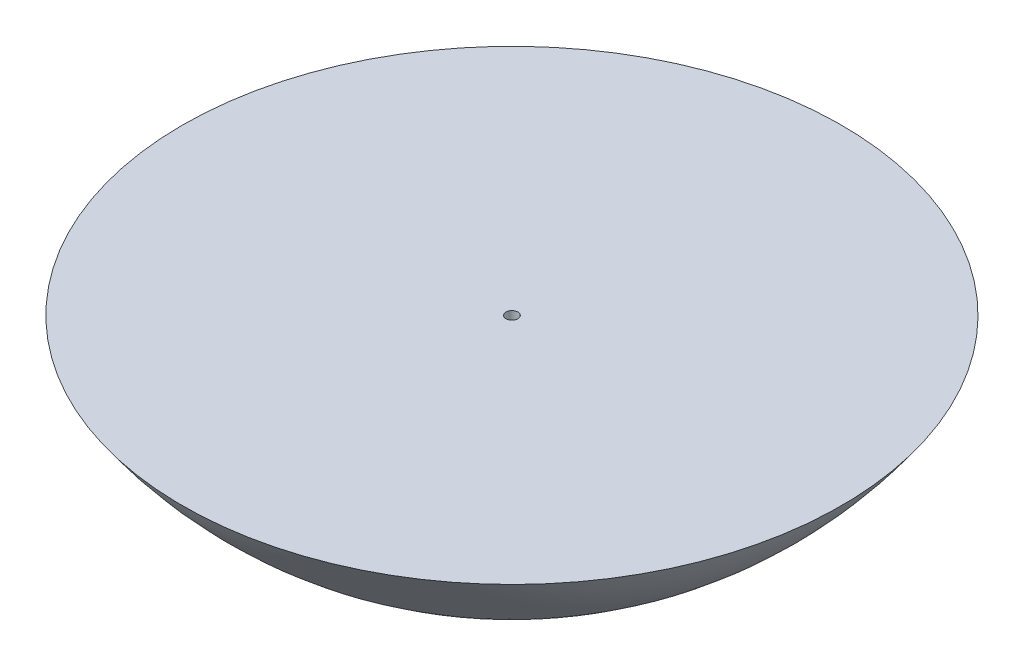
ISO-10303-21;
HEADER;
FILE_DESCRIPTION(('STEP AP214'),'2;1');
FILE_NAME('part.step','',(''),(''),'','','');
FILE_SCHEMA(('AUTOMOTIVE_DESIGN { 1 0 10303 214 1 1 1 1 }'));
ENDSEC;
DATA;
#1=APPLICATION_CONTEXT('core data for automotive mechanical design processes');
#2=APPLICATION_PROTOCOL_DEFINITION('international standard','automotive_design',2000,#1);
#3=PRODUCT_CONTEXT('',#1,'mechanical');
#4=PRODUCT('Part','Part','',(#3));
#5=PRODUCT_RELATED_PRODUCT_CATEGORY('part','',(#4));
#6=PRODUCT_DEFINITION_FORMATION('','',#4);
#7=PRODUCT_DEFINITION_CONTEXT('part definition',#1,'design');
#8=PRODUCT_DEFINITION('design','',#6,#7);
#9=PRODUCT_DEFINITION_SHAPE('','',#8);
#10=(LENGTH_UNIT() NAMED_UNIT(*) SI_UNIT(.MILLI.,.METRE.));
#11=(NAMED_UNIT(*) PLANE_ANGLE_UNIT() SI_UNIT($,.RADIAN.));
#12=(NAMED_UNIT(*) SI_UNIT($,.STERADIAN.) SOLID_ANGLE_UNIT());
#13=UNCERTAINTY_MEASURE_WITH_UNIT(LENGTH_MEASURE(1.E-05),#10,'distance_accuracy_value','');
#14=(GEOMETRIC_REPRESENTATION_CONTEXT(3) GLOBAL_UNCERTAINTY_ASSIGNED_CONTEXT((#13)) GLOBAL_UNIT_ASSIGNED_CONTEXT((#10,
#11,#12)) REPRESENTATION_CONTEXT('',''));
#15=CARTESIAN_POINT('',(0.,0.,0.));
#16=DIRECTION('',(0.,0.,1.));
#17=DIRECTION('',(1.,0.,0.));
#18=AXIS2_PLACEMENT_3D('',#15,#16,#17);
#19=CARTESIAN_POINT('',(0.,0.,0.));
#20=DIRECTION('',(0.,-1.,0.));
#21=DIRECTION('',(-1.,0.,0.));
#22=AXIS2_PLACEMENT_3D('',#19,#20,#21);
#23=SPHERICAL_SURFACE('',#22,33.8);
#24=CARTESIAN_POINT('',(0.,-33.7963015728053,0.));
#25=DIRECTION('',(0.,1.,0.));
#26=DIRECTION('',(0.,0.,1.));
#27=AXIS2_PLACEMENT_3D('',#24,#25,#26);
#28=CIRCLE('',#27,0.5);
#29=CARTESIAN_POINT('',(-0.49999999999911,-33.7963015728053,0.));
#30=VERTEX_POINT('',#29);
#31=EDGE_CURVE('E41',#30,#30,#28,.F.);
#32=CARTESIAN_POINT('',(0.,-19.1,0.));
#33=DIRECTION('',(0.,1.,0.));
#34=DIRECTION('',(0.,0.,1.));
#35=AXIS2_PLACEMENT_3D('',#32,#33,#34);
#36=CIRCLE('',#35,27.8860180018589);
#37=CARTESIAN_POINT('',(-27.8860180018589,-19.1,0.));
#38=VERTEX_POINT('',#37);
#39=EDGE_CURVE('E10',#38,#38,#36,.F.);
#40=CARTESIAN_POINT('',(-0.49999999999911,-33.7963015728053,0.));
#41=CARTESIAN_POINT('',(-0.836365526880755,-33.7913268142274,0.));
#42=CARTESIAN_POINT('',(-1.17265663130979,-33.781327268668,0.));
#43=CARTESIAN_POINT('',(-1.84479052535185,-33.7512945718674,0.));
#44=CARTESIAN_POINT('',(-2.18063331496486,-33.7312614206261,0.));
#45=CARTESIAN_POINT('',(-2.85157110946406,-33.6811774807426,0.));
#46=CARTESIAN_POINT('',(-3.18666611435024,-33.6511266921004,0.));
#47=CARTESIAN_POINT('',(-3.85580964317948,-33.5810347725187,0.));
#48=CARTESIAN_POINT('',(-4.18985816712254,-33.5409936415792,0.));
#49=CARTESIAN_POINT('',(-4.85661094203624,-33.4509565961698,0.));
#50=CARTESIAN_POINT('',(-5.18931519300689,-33.4009606816999,0.));
#51=CARTESIAN_POINT('',(-5.85308283598062,-33.2910586742126,0.));
#52=CARTESIAN_POINT('',(-6.1841462279837,-33.2311525811952,0.));
#53=CARTESIAN_POINT('',(-6.84433702770295,-33.1014836098706,0.));
#54=CARTESIAN_POINT('',(-7.17346443541912,-33.0317207315635,0.));
#55=CARTESIAN_POINT('',(-7.82948986762119,-32.8824003820559,0.));
#56=CARTESIAN_POINT('',(-8.15638789210708,-32.8028429108554,0.));
#57=CARTESIAN_POINT('',(-8.80766314613037,-32.6340042959903,0.));
#58=CARTESIAN_POINT('',(-9.13204037566776,-32.5447231523257,0.));
#59=CARTESIAN_POINT('',(-9.77798487526613,-32.3565167819701,0.));
#60=CARTESIAN_POINT('',(-10.0995521453271,-32.2575915552792,0.));
#61=CARTESIAN_POINT('',(-10.739590066359,-32.0501852052427,0.));
#62=CARTESIAN_POINT('',(-11.05806071733,-31.9417040818973,0.));
#63=CARTESIAN_POINT('',(-11.6916215010376,-31.7152826435462,0.));
#64=CARTESIAN_POINT('',(-12.0067116337742,-31.5973423285405,0.));
#65=CARTESIAN_POINT('',(-12.6332304954148,-31.3521076441973,0.));
#66=CARTESIAN_POINT('',(-12.9446592243188,-31.2248132748598,0.));
#67=CARTESIAN_POINT('',(-13.5635776566371,-30.9609839578133,0.));
#68=CARTESIAN_POINT('',(-13.8710673600514,-30.8244490101042,0.));
#69=CARTESIAN_POINT('',(-14.4818336311587,-30.5422602497431,0.));
#70=CARTESIAN_POINT('',(-14.7851101988518,-30.3966064370911,0.));
#71=CARTESIAN_POINT('',(-15.3871798440648,-30.0963097892417,0.));
#72=CARTESIAN_POINT('',(-15.6859729215848,-29.9416669540443,0.));
#73=CARTESIAN_POINT('',(-16.2788092287858,-29.6235301167231,0.));
#74=CARTESIAN_POINT('',(-16.5728524584668,-29.4600361145992,0.));
#75=CARTESIAN_POINT('',(-17.1559269465534,-29.1243426893745,0.));
#76=CARTESIAN_POINT('',(-17.4449582049589,-28.9521432662737,0.));
#77=CARTESIAN_POINT('',(-18.0177510949557,-28.5991925054506,0.));
#78=CARTESIAN_POINT('',(-18.301512726547,-28.4184411677283,0.));
#79=CARTESIAN_POINT('',(-18.8635134049605,-28.0485477075815,0.));
#80=CARTESIAN_POINT('',(-19.1417524517828,-27.8594055851571,0.));
#81=CARTESIAN_POINT('',(-19.6924599257844,-27.4728991654496,0.));
#82=CARTESIAN_POINT('',(-19.9649283529637,-27.2755348681666,0.));
#83=CARTESIAN_POINT('',(-20.5038516970008,-26.8727600382069,0.));
#84=CARTESIAN_POINT('',(-20.7703066138585,-26.6673495055302,0.));
#85=CARTESIAN_POINT('',(-21.2969654072749,-26.2486653170163,0.));
#86=CARTESIAN_POINT('',(-21.5571692838335,-26.0353916611791,0.));
#87=CARTESIAN_POINT('',(-22.0710940391859,-25.6011713481584,0.));
#88=CARTESIAN_POINT('',(-22.3248149179796,-25.3802246909749,0.));
#89=CARTESIAN_POINT('',(-22.8255474993817,-24.9308553369963,0.));
#90=CARTESIAN_POINT('',(-23.07255920199,-24.7024326402012,0.));
#91=CARTESIAN_POINT('',(-23.559653234181,-24.2383148337373,0.));
#92=CARTESIAN_POINT('',(-23.7997355637637,-24.0026197240685,0.));
#93=CARTESIAN_POINT('',(-24.2727568275432,-23.5241671995995,0.));
#94=CARTESIAN_POINT('',(-24.5056957617401,-23.2814097847994,0.));
#95=CARTESIAN_POINT('',(-24.964222590323,-22.7890490607582,0.));
#96=CARTESIAN_POINT('',(-25.189810484709,-22.5394457515172,0.));
#97=CARTESIAN_POINT('',(-25.6334341050133,-22.0336157248192,0.));
#98=CARTESIAN_POINT('',(-25.8514698309315,-21.7773890073622,0.));
#99=CARTESIAN_POINT('',(-26.2797948571244,-21.2585406563949,0.));
#100=CARTESIAN_POINT('',(-26.4900841573991,-20.9959190228845,0.));
#101=CARTESIAN_POINT('',(-26.9027284613781,-20.4645146537686,0.));
#102=CARTESIAN_POINT('',(-27.1050834650823,-20.1957319181631,0.));
#103=CARTESIAN_POINT('',(-27.5016803159094,-19.652246065255,0.));
#104=CARTESIAN_POINT('',(-27.6959221630322,-19.3775429479523,0.));
#105=CARTESIAN_POINT('',(-27.8860180018589,-19.1,0.));
#106=B_SPLINE_CURVE_WITH_KNOTS('',3,(#40,#41,#42,#43,#44,#45,#46,#47,#48,#49,#50,#51,#52,#53,
#54,#55,#56,#57,#58,#59,#60,#61,#62,#63,#64,#65,#66,#67,#68,#69,#70,#71,#72,#73,#74,#75,#76,#77,
#78,#79,#80,#81,#82,#83,#84,#85,#86,#87,#88,#89,#90,#91,#92,#93,#94,#95,#96,#97,#98,#99,#100,
#101,#102,#103,#104,#105),.UNSPECIFIED.,.F.,.F.,(4,2,2,2,2,2,2,2,2,2,2,2,2,2,2,2,2,2,2,2,2,2,2,
2,2,2,2,2,2,2,2,2,4),(0.,1.00916931023588,2.01833862047176,3.02750793070764,4.03667724094352,
5.04584655117941,6.05501586141528,7.06418517165117,8.07335448188705,9.08252379212293,
10.0916931023588,11.1008624125947,12.1100317228306,13.1192010330664,14.1283703433023,
15.1375396535382,16.1467089637741,17.15587827401,18.1650475842459,19.1742168944817,
20.1833862047176,21.1925555149535,22.2017248251894,23.2108941354253,24.2200634456611,
25.229232755897,26.2384020661329,27.2475713763688,28.2567406866047,29.2659099968405,
30.2750793070764,31.2842486173123,32.2934179275482),.UNSPECIFIED.);
#107=EDGE_CURVE('BSEAM35',#30,#38,#106,.T.);
#108=ORIENTED_EDGE('',*,*,#31,.F.);
#109=ORIENTED_EDGE('',*,*,#39,.T.);
#110=ORIENTED_EDGE('',*,*,#107,.T.);
#111=ORIENTED_EDGE('',*,*,#107,.F.);
#112=EDGE_LOOP('',(#108,#110,#109,#111));
#113=FACE_BOUND('',#112,.T.);
#114=ADVANCED_FACE('F35',(#113),#23,.T.);
#115=CARTESIAN_POINT('',(0.,-19.1,0.));
#116=DIRECTION('',(0.,1.,0.));
#117=DIRECTION('',(0.,0.,1.));
#118=AXIS2_PLACEMENT_3D('',#115,#116,#117);
#119=PLANE('',#118);
#120=CARTESIAN_POINT('',(0.,-19.1,0.));
#121=DIRECTION('',(0.,1.,0.));
#122=DIRECTION('',(0.,0.,1.));
#123=AXIS2_PLACEMENT_3D('',#120,#121,#122);
#124=CIRCLE('',#123,0.5);
#125=CARTESIAN_POINT('',(0.,-19.1,0.5));
#126=VERTEX_POINT('',#125);
#127=EDGE_CURVE('E45',#126,#126,#124,.T.);
#128=ORIENTED_EDGE('',*,*,#127,.F.);
#129=EDGE_LOOP('',(#128));
#130=FACE_BOUND('',#129,.T.);
#131=ORIENTED_EDGE('',*,*,#39,.F.);
#132=EDGE_LOOP('',(#131));
#133=FACE_BOUND('',#132,.T.);
#134=ADVANCED_FACE('F54',(#130,#133),#119,.T.);
#135=CARTESIAN_POINT('',(0.,-33.8,0.));
#136=DIRECTION('',(0.,1.,0.));
#137=DIRECTION('',(0.,0.,1.));
#138=AXIS2_PLACEMENT_3D('',#135,#136,#137);
#139=CYLINDRICAL_SURFACE('',#138,0.5);
#140=ORIENTED_EDGE('',*,*,#31,.T.);
#141=EDGE_LOOP('',(#140));
#142=FACE_BOUND('',#141,.T.);
#143=ORIENTED_EDGE('',*,*,#127,.T.);
#144=EDGE_LOOP('',(#143));
#145=FACE_BOUND('',#144,.T.);
#146=ADVANCED_FACE('F52',(#142,#145),#139,.F.);
#147=CLOSED_SHELL('',(#114,#134,#146));
#148=MANIFOLD_SOLID_BREP('B2',#147);
#149=ADVANCED_BREP_SHAPE_REPRESENTATION('',(#18,#148),#14);
#150=SHAPE_DEFINITION_REPRESENTATION(#9,#149);
ENDSEC;
END-ISO-10303-21;
